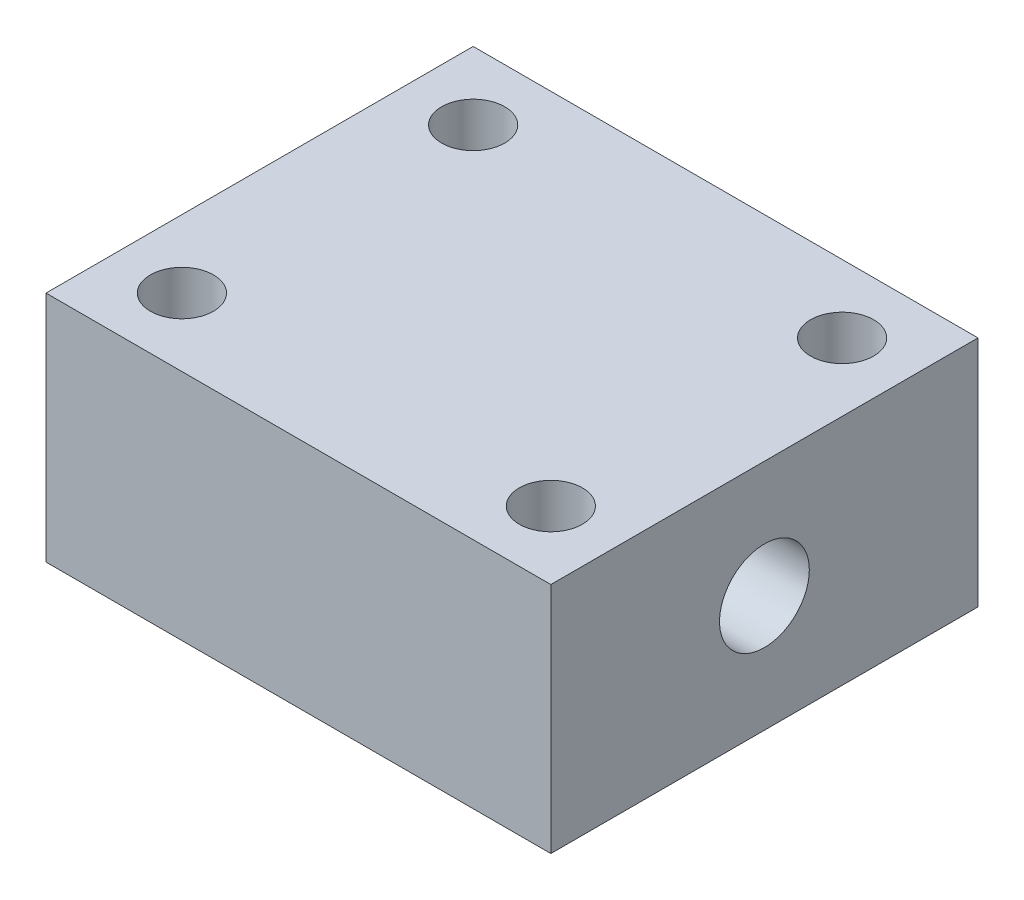
ISO-10303-21;
HEADER;
FILE_DESCRIPTION(('STEP AP214'),'2;1');
FILE_NAME('part.step','',(''),(''),'','','');
FILE_SCHEMA(('AUTOMOTIVE_DESIGN { 1 0 10303 214 1 1 1 1 }'));
ENDSEC;
DATA;
#1=APPLICATION_CONTEXT('core data for automotive mechanical design processes');
#2=APPLICATION_PROTOCOL_DEFINITION('international standard','automotive_design',2000,#1);
#3=PRODUCT_CONTEXT('',#1,'mechanical');
#4=PRODUCT('Part','Part','',(#3));
#5=PRODUCT_RELATED_PRODUCT_CATEGORY('part','',(#4));
#6=PRODUCT_DEFINITION_FORMATION('','',#4);
#7=PRODUCT_DEFINITION_CONTEXT('part definition',#1,'design');
#8=PRODUCT_DEFINITION('design','',#6,#7);
#9=PRODUCT_DEFINITION_SHAPE('','',#8);
#10=(LENGTH_UNIT() NAMED_UNIT(*) SI_UNIT(.MILLI.,.METRE.));
#11=(NAMED_UNIT(*) PLANE_ANGLE_UNIT() SI_UNIT($,.RADIAN.));
#12=(NAMED_UNIT(*) SI_UNIT($,.STERADIAN.) SOLID_ANGLE_UNIT());
#13=UNCERTAINTY_MEASURE_WITH_UNIT(LENGTH_MEASURE(1.E-05),#10,'distance_accuracy_value','');
#14=(GEOMETRIC_REPRESENTATION_CONTEXT(3) GLOBAL_UNCERTAINTY_ASSIGNED_CONTEXT((#13)) GLOBAL_UNIT_ASSIGNED_CONTEXT((#10,
#11,#12)) REPRESENTATION_CONTEXT('',''));
#15=CARTESIAN_POINT('',(0.,0.,0.));
#16=DIRECTION('',(0.,0.,1.));
#17=DIRECTION('',(1.,0.,0.));
#18=AXIS2_PLACEMENT_3D('',#15,#16,#17);
#19=CARTESIAN_POINT('',(41.275,19.05,34.925));
#20=DIRECTION('',(-1.,0.,0.));
#21=DIRECTION('',(0.,0.,1.));
#22=AXIS2_PLACEMENT_3D('',#19,#20,#21);
#23=PLANE('',#22);
#24=CARTESIAN_POINT('',(41.275,0.,0.));
#25=DIRECTION('',(1.,0.,0.));
#26=DIRECTION('',(0.,0.,-1.));
#27=AXIS2_PLACEMENT_3D('',#24,#25,#26);
#28=CIRCLE('',#27,7.3421875);
#29=CARTESIAN_POINT('',(41.275,0.,-7.3421875));
#30=VERTEX_POINT('',#29);
#31=EDGE_CURVE('E266',#30,#30,#28,.T.);
#32=ORIENTED_EDGE('',*,*,#31,.F.);
#33=EDGE_LOOP('',(#32));
#34=FACE_BOUND('',#33,.T.);
#35=DIRECTION('',(0.,0.,-1.));
#36=VECTOR('',#35,1.);
#37=CARTESIAN_POINT('',(41.275,-19.05,34.925));
#38=LINE('',#37,#36);
#39=CARTESIAN_POINT('',(41.275,-19.05,34.925));
#40=VERTEX_POINT('',#39);
#41=CARTESIAN_POINT('',(41.275,-19.05,-34.925));
#42=VERTEX_POINT('',#41);
#43=EDGE_CURVE('E197',#40,#42,#38,.T.);
#44=ORIENTED_EDGE('',*,*,#43,.T.);
#45=DIRECTION('',(0.,-1.,0.));
#46=VECTOR('',#45,1.);
#47=CARTESIAN_POINT('',(41.275,19.05,-34.925));
#48=LINE('',#47,#46);
#49=CARTESIAN_POINT('',(41.275,19.05,-34.925));
#50=VERTEX_POINT('',#49);
#51=EDGE_CURVE('E238',#50,#42,#48,.T.);
#52=ORIENTED_EDGE('',*,*,#51,.F.);
#53=DIRECTION('',(0.,0.,-1.));
#54=VECTOR('',#53,1.);
#55=CARTESIAN_POINT('',(41.275,19.05,34.925));
#56=LINE('',#55,#54);
#57=CARTESIAN_POINT('',(41.275,19.05,34.925));
#58=VERTEX_POINT('',#57);
#59=EDGE_CURVE('E201',#58,#50,#56,.T.);
#60=ORIENTED_EDGE('',*,*,#59,.F.);
#61=DIRECTION('',(0.,-1.,0.));
#62=VECTOR('',#61,1.);
#63=CARTESIAN_POINT('',(41.275,19.05,34.925));
#64=LINE('',#63,#62);
#65=EDGE_CURVE('E215',#58,#40,#64,.T.);
#66=ORIENTED_EDGE('',*,*,#65,.T.);
#67=EDGE_LOOP('',(#44,#52,#60,#66));
#68=FACE_BOUND('',#67,.T.);
#69=ADVANCED_FACE('F45',(#34,#68),#23,.F.);
#70=CARTESIAN_POINT('',(-41.275,19.05,-34.925));
#71=DIRECTION('',(0.,0.,1.));
#72=DIRECTION('',(1.,0.,0.));
#73=AXIS2_PLACEMENT_3D('',#70,#71,#72);
#74=PLANE('',#73);
#75=DIRECTION('',(-1.,0.,0.));
#76=VECTOR('',#75,1.);
#77=CARTESIAN_POINT('',(-41.275,-19.05,-34.925));
#78=LINE('',#77,#76);
#79=CARTESIAN_POINT('',(-41.275,-19.05,-34.925));
#80=VERTEX_POINT('',#79);
#81=EDGE_CURVE('E219',#42,#80,#78,.T.);
#82=ORIENTED_EDGE('',*,*,#81,.T.);
#83=DIRECTION('',(0.,-1.,0.));
#84=VECTOR('',#83,1.);
#85=CARTESIAN_POINT('',(-41.275,19.05,-34.925));
#86=LINE('',#85,#84);
#87=CARTESIAN_POINT('',(-41.275,19.05,-34.925));
#88=VERTEX_POINT('',#87);
#89=EDGE_CURVE('E234',#88,#80,#86,.T.);
#90=ORIENTED_EDGE('',*,*,#89,.F.);
#91=DIRECTION('',(-1.,0.,0.));
#92=VECTOR('',#91,1.);
#93=CARTESIAN_POINT('',(-41.275,19.05,-34.925));
#94=LINE('',#93,#92);
#95=EDGE_CURVE('E205',#50,#88,#94,.T.);
#96=ORIENTED_EDGE('',*,*,#95,.F.);
#97=ORIENTED_EDGE('',*,*,#51,.T.);
#98=EDGE_LOOP('',(#82,#90,#96,#97));
#99=FACE_BOUND('',#98,.T.);
#100=ADVANCED_FACE('F275',(#99),#74,.F.);
#101=CARTESIAN_POINT('',(-41.275,19.05,34.925));
#102=DIRECTION('',(1.,0.,0.));
#103=DIRECTION('',(0.,0.,-1.));
#104=AXIS2_PLACEMENT_3D('',#101,#102,#103);
#105=PLANE('',#104);
#106=DIRECTION('',(0.,0.,1.));
#107=VECTOR('',#106,1.);
#108=CARTESIAN_POINT('',(-41.275,-19.05,34.925));
#109=LINE('',#108,#107);
#110=CARTESIAN_POINT('',(-41.275,-19.05,34.925));
#111=VERTEX_POINT('',#110);
#112=EDGE_CURVE('E222',#80,#111,#109,.T.);
#113=ORIENTED_EDGE('',*,*,#112,.T.);
#114=DIRECTION('',(0.,-1.,0.));
#115=VECTOR('',#114,1.);
#116=CARTESIAN_POINT('',(-41.275,19.05,34.925));
#117=LINE('',#116,#115);
#118=CARTESIAN_POINT('',(-41.275,19.05,34.925));
#119=VERTEX_POINT('',#118);
#120=EDGE_CURVE('E230',#119,#111,#117,.T.);
#121=ORIENTED_EDGE('',*,*,#120,.F.);
#122=DIRECTION('',(0.,0.,1.));
#123=VECTOR('',#122,1.);
#124=CARTESIAN_POINT('',(-41.275,19.05,34.925));
#125=LINE('',#124,#123);
#126=EDGE_CURVE('E209',#88,#119,#125,.T.);
#127=ORIENTED_EDGE('',*,*,#126,.F.);
#128=ORIENTED_EDGE('',*,*,#89,.T.);
#129=EDGE_LOOP('',(#113,#121,#127,#128));
#130=FACE_BOUND('',#129,.T.);
#131=ADVANCED_FACE('F294',(#130),#105,.F.);
#132=CARTESIAN_POINT('',(-41.275,19.05,34.925));
#133=DIRECTION('',(0.,0.,-1.));
#134=DIRECTION('',(-1.,0.,0.));
#135=AXIS2_PLACEMENT_3D('',#132,#133,#134);
#136=PLANE('',#135);
#137=DIRECTION('',(1.,0.,0.));
#138=VECTOR('',#137,1.);
#139=CARTESIAN_POINT('',(-41.275,-19.05,34.925));
#140=LINE('',#139,#138);
#141=EDGE_CURVE('E206',#111,#40,#140,.T.);
#142=ORIENTED_EDGE('',*,*,#141,.T.);
#143=ORIENTED_EDGE('',*,*,#65,.F.);
#144=DIRECTION('',(1.,0.,0.));
#145=VECTOR('',#144,1.);
#146=CARTESIAN_POINT('',(-41.275,19.05,34.925));
#147=LINE('',#146,#145);
#148=EDGE_CURVE('E212',#119,#58,#147,.T.);
#149=ORIENTED_EDGE('',*,*,#148,.F.);
#150=ORIENTED_EDGE('',*,*,#120,.T.);
#151=EDGE_LOOP('',(#142,#143,#149,#150));
#152=FACE_BOUND('',#151,.T.);
#153=ADVANCED_FACE('F292',(#152),#136,.F.);
#154=CARTESIAN_POINT('',(0.,19.05,0.));
#155=DIRECTION('',(0.,-1.,0.));
#156=DIRECTION('',(0.,0.,-1.));
#157=AXIS2_PLACEMENT_3D('',#154,#155,#156);
#158=PLANE('',#157);
#159=CARTESIAN_POINT('',(30.1625,19.05,23.8125));
#160=DIRECTION('',(0.,1.,0.));
#161=DIRECTION('',(0.,0.,1.));
#162=AXIS2_PLACEMENT_3D('',#159,#160,#161);
#163=CIRCLE('',#162,5.159375);
#164=CARTESIAN_POINT('',(30.1625,19.05,28.971875));
#165=VERTEX_POINT('',#164);
#166=EDGE_CURVE('E182',#165,#165,#163,.T.);
#167=ORIENTED_EDGE('',*,*,#166,.F.);
#168=EDGE_LOOP('',(#167));
#169=FACE_BOUND('',#168,.T.);
#170=CARTESIAN_POINT('',(-30.1625,19.05,-23.8125));
#171=DIRECTION('',(0.,1.,0.));
#172=DIRECTION('',(0.,0.,1.));
#173=AXIS2_PLACEMENT_3D('',#170,#171,#172);
#174=CIRCLE('',#173,5.159375);
#175=CARTESIAN_POINT('',(-30.1625,19.05,-18.653125));
#176=VERTEX_POINT('',#175);
#177=EDGE_CURVE('E173',#176,#176,#174,.T.);
#178=ORIENTED_EDGE('',*,*,#177,.F.);
#179=EDGE_LOOP('',(#178));
#180=FACE_BOUND('',#179,.T.);
#181=CARTESIAN_POINT('',(30.1625,19.05,-23.8125));
#182=DIRECTION('',(0.,1.,0.));
#183=DIRECTION('',(0.,0.,1.));
#184=AXIS2_PLACEMENT_3D('',#181,#182,#183);
#185=CIRCLE('',#184,5.159375);
#186=CARTESIAN_POINT('',(30.1625,19.05,-18.653125));
#187=VERTEX_POINT('',#186);
#188=EDGE_CURVE('E163',#187,#187,#185,.T.);
#189=ORIENTED_EDGE('',*,*,#188,.F.);
#190=EDGE_LOOP('',(#189));
#191=FACE_BOUND('',#190,.T.);
#192=CARTESIAN_POINT('',(-30.1625,19.05,23.8125));
#193=DIRECTION('',(0.,1.,0.));
#194=DIRECTION('',(0.,0.,1.));
#195=AXIS2_PLACEMENT_3D('',#192,#193,#194);
#196=CIRCLE('',#195,5.159375);
#197=CARTESIAN_POINT('',(-30.1625,19.05,28.971875));
#198=VERTEX_POINT('',#197);
#199=EDGE_CURVE('E193',#198,#198,#196,.T.);
#200=ORIENTED_EDGE('',*,*,#199,.F.);
#201=EDGE_LOOP('',(#200));
#202=FACE_BOUND('',#201,.T.);
#203=ORIENTED_EDGE('',*,*,#59,.T.);
#204=ORIENTED_EDGE('',*,*,#95,.T.);
#205=ORIENTED_EDGE('',*,*,#126,.T.);
#206=ORIENTED_EDGE('',*,*,#148,.T.);
#207=EDGE_LOOP('',(#203,#204,#205,#206));
#208=FACE_BOUND('',#207,.T.);
#209=ADVANCED_FACE('F288',(#169,#180,#191,#202,#208),#158,.F.);
#210=CARTESIAN_POINT('',(0.,-19.05,0.));
#211=DIRECTION('',(0.,-1.,0.));
#212=DIRECTION('',(0.,0.,-1.));
#213=AXIS2_PLACEMENT_3D('',#210,#211,#212);
#214=PLANE('',#213);
#215=CARTESIAN_POINT('',(-17.4625,-19.05,0.));
#216=DIRECTION('',(0.,1.,0.));
#217=DIRECTION('',(0.,0.,1.));
#218=AXIS2_PLACEMENT_3D('',#215,#216,#217);
#219=CIRCLE('',#218,12.7254);
#220=CARTESIAN_POINT('',(-17.4625,-19.05,12.7254));
#221=VERTEX_POINT('',#220);
#222=EDGE_CURVE('E155',#221,#221,#219,.T.);
#223=ORIENTED_EDGE('',*,*,#222,.T.);
#224=EDGE_LOOP('',(#223));
#225=FACE_BOUND('',#224,.T.);
#226=CARTESIAN_POINT('',(17.4625,-19.05,0.));
#227=DIRECTION('',(0.,1.,0.));
#228=DIRECTION('',(0.,0.,1.));
#229=AXIS2_PLACEMENT_3D('',#226,#227,#228);
#230=CIRCLE('',#229,12.7254);
#231=CARTESIAN_POINT('',(17.4625,-19.05,12.7254));
#232=VERTEX_POINT('',#231);
#233=EDGE_CURVE('E149',#232,#232,#230,.T.);
#234=ORIENTED_EDGE('',*,*,#233,.T.);
#235=EDGE_LOOP('',(#234));
#236=FACE_BOUND('',#235,.T.);
#237=CARTESIAN_POINT('',(30.1625,-19.05,23.8125));
#238=DIRECTION('',(0.,1.,0.));
#239=DIRECTION('',(0.,0.,1.));
#240=AXIS2_PLACEMENT_3D('',#237,#238,#239);
#241=CIRCLE('',#240,5.159375);
#242=CARTESIAN_POINT('',(30.1625,-19.05,28.971875));
#243=VERTEX_POINT('',#242);
#244=EDGE_CURVE('E177',#243,#243,#241,.T.);
#245=ORIENTED_EDGE('',*,*,#244,.T.);
#246=EDGE_LOOP('',(#245));
#247=FACE_BOUND('',#246,.T.);
#248=CARTESIAN_POINT('',(-30.1625,-19.05,-23.8125));
#249=DIRECTION('',(0.,1.,0.));
#250=DIRECTION('',(0.,0.,1.));
#251=AXIS2_PLACEMENT_3D('',#248,#249,#250);
#252=CIRCLE('',#251,5.159375);
#253=CARTESIAN_POINT('',(-30.1625,-19.05,-18.653125));
#254=VERTEX_POINT('',#253);
#255=EDGE_CURVE('E186',#254,#254,#252,.T.);
#256=ORIENTED_EDGE('',*,*,#255,.T.);
#257=EDGE_LOOP('',(#256));
#258=FACE_BOUND('',#257,.T.);
#259=CARTESIAN_POINT('',(30.1625,-19.05,-23.8125));
#260=DIRECTION('',(0.,1.,0.));
#261=DIRECTION('',(0.,0.,1.));
#262=AXIS2_PLACEMENT_3D('',#259,#260,#261);
#263=CIRCLE('',#262,5.159375);
#264=CARTESIAN_POINT('',(30.1625,-19.05,-18.653125));
#265=VERTEX_POINT('',#264);
#266=EDGE_CURVE('E169',#265,#265,#263,.T.);
#267=ORIENTED_EDGE('',*,*,#266,.T.);
#268=EDGE_LOOP('',(#267));
#269=FACE_BOUND('',#268,.T.);
#270=CARTESIAN_POINT('',(-30.1625,-19.05,23.8125));
#271=DIRECTION('',(0.,1.,0.));
#272=DIRECTION('',(0.,0.,1.));
#273=AXIS2_PLACEMENT_3D('',#270,#271,#272);
#274=CIRCLE('',#273,5.159375);
#275=CARTESIAN_POINT('',(-30.1625,-19.05,28.971875));
#276=VERTEX_POINT('',#275);
#277=EDGE_CURVE('E181',#276,#276,#274,.T.);
#278=ORIENTED_EDGE('',*,*,#277,.T.);
#279=EDGE_LOOP('',(#278));
#280=FACE_BOUND('',#279,.T.);
#281=ORIENTED_EDGE('',*,*,#43,.F.);
#282=ORIENTED_EDGE('',*,*,#141,.F.);
#283=ORIENTED_EDGE('',*,*,#112,.F.);
#284=ORIENTED_EDGE('',*,*,#81,.F.);
#285=EDGE_LOOP('',(#281,#282,#283,#284));
#286=FACE_BOUND('',#285,.T.);
#287=ADVANCED_FACE('F282',(#225,#236,#247,#258,#269,#280,#286),#214,.T.);
#288=CARTESIAN_POINT('',(-30.1625,19.05,23.8125));
#289=DIRECTION('',(0.,-1.,0.));
#290=DIRECTION('',(0.,0.,-1.));
#291=AXIS2_PLACEMENT_3D('',#288,#289,#290);
#292=CYLINDRICAL_SURFACE('',#291,5.159375);
#293=ORIENTED_EDGE('',*,*,#199,.T.);
#294=EDGE_LOOP('',(#293));
#295=FACE_BOUND('',#294,.T.);
#296=ORIENTED_EDGE('',*,*,#277,.F.);
#297=EDGE_LOOP('',(#296));
#298=FACE_BOUND('',#297,.T.);
#299=ADVANCED_FACE('F305',(#295,#298),#292,.F.);
#300=CARTESIAN_POINT('',(30.1625,19.05,-23.8125));
#301=DIRECTION('',(0.,-1.,0.));
#302=DIRECTION('',(0.,0.,-1.));
#303=AXIS2_PLACEMENT_3D('',#300,#301,#302);
#304=CYLINDRICAL_SURFACE('',#303,5.159375);
#305=ORIENTED_EDGE('',*,*,#188,.T.);
#306=EDGE_LOOP('',(#305));
#307=FACE_BOUND('',#306,.T.);
#308=ORIENTED_EDGE('',*,*,#266,.F.);
#309=EDGE_LOOP('',(#308));
#310=FACE_BOUND('',#309,.T.);
#311=ADVANCED_FACE('F312',(#307,#310),#304,.F.);
#312=CARTESIAN_POINT('',(-30.1625,19.05,-23.8125));
#313=DIRECTION('',(0.,-1.,0.));
#314=DIRECTION('',(0.,0.,-1.));
#315=AXIS2_PLACEMENT_3D('',#312,#313,#314);
#316=CYLINDRICAL_SURFACE('',#315,5.159375);
#317=ORIENTED_EDGE('',*,*,#177,.T.);
#318=EDGE_LOOP('',(#317));
#319=FACE_BOUND('',#318,.T.);
#320=ORIENTED_EDGE('',*,*,#255,.F.);
#321=EDGE_LOOP('',(#320));
#322=FACE_BOUND('',#321,.T.);
#323=ADVANCED_FACE('F314',(#319,#322),#316,.F.);
#324=CARTESIAN_POINT('',(30.1625,19.05,23.8125));
#325=DIRECTION('',(0.,-1.,0.));
#326=DIRECTION('',(0.,0.,-1.));
#327=AXIS2_PLACEMENT_3D('',#324,#325,#326);
#328=CYLINDRICAL_SURFACE('',#327,5.159375);
#329=ORIENTED_EDGE('',*,*,#166,.T.);
#330=EDGE_LOOP('',(#329));
#331=FACE_BOUND('',#330,.T.);
#332=ORIENTED_EDGE('',*,*,#244,.F.);
#333=EDGE_LOOP('',(#332));
#334=FACE_BOUND('',#333,.T.);
#335=ADVANCED_FACE('F317',(#331,#334),#328,.F.);
#336=CARTESIAN_POINT('',(-17.4625,-16.2306,0.));
#337=DIRECTION('',(0.,-1.,0.));
#338=DIRECTION('',(0.,0.,-1.));
#339=AXIS2_PLACEMENT_3D('',#336,#337,#338);
#340=CYLINDRICAL_SURFACE('',#339,12.7254);
#341=CARTESIAN_POINT('',(-17.4625,-16.2306,0.));
#342=DIRECTION('',(0.,1.,0.));
#343=DIRECTION('',(0.,0.,1.));
#344=AXIS2_PLACEMENT_3D('',#341,#342,#343);
#345=CIRCLE('',#344,12.7254);
#346=CARTESIAN_POINT('',(-17.4625,-16.2306,12.7254));
#347=VERTEX_POINT('',#346);
#348=EDGE_CURVE('E246',#347,#347,#345,.T.);
#349=ORIENTED_EDGE('',*,*,#348,.T.);
#350=EDGE_LOOP('',(#349));
#351=FACE_BOUND('',#350,.T.);
#352=ORIENTED_EDGE('',*,*,#222,.F.);
#353=EDGE_LOOP('',(#352));
#354=FACE_BOUND('',#353,.T.);
#355=ADVANCED_FACE('F321',(#351,#354),#340,.F.);
#356=CARTESIAN_POINT('',(-17.4625,-16.2306,0.));
#357=DIRECTION('',(0.,1.,0.));
#358=DIRECTION('',(0.,0.,1.));
#359=AXIS2_PLACEMENT_3D('',#356,#357,#358);
#360=PLANE('',#359);
#361=CARTESIAN_POINT('',(-17.4625,-16.2306,0.));
#362=DIRECTION('',(0.,1.,0.));
#363=DIRECTION('',(0.,0.,1.));
#364=AXIS2_PLACEMENT_3D('',#361,#362,#363);
#365=CIRCLE('',#364,7.3421875);
#366=CARTESIAN_POINT('',(-17.4625,-16.2306,7.3421875));
#367=VERTEX_POINT('',#366);
#368=EDGE_CURVE('E242',#367,#367,#365,.T.);
#369=ORIENTED_EDGE('',*,*,#368,.T.);
#370=EDGE_LOOP('',(#369));
#371=FACE_BOUND('',#370,.T.);
#372=ORIENTED_EDGE('',*,*,#348,.F.);
#373=EDGE_LOOP('',(#372));
#374=FACE_BOUND('',#373,.T.);
#375=ADVANCED_FACE('F349',(#371,#374),#360,.F.);
#376=CARTESIAN_POINT('',(17.4625,-16.2306,0.));
#377=DIRECTION('',(0.,-1.,0.));
#378=DIRECTION('',(0.,0.,-1.));
#379=AXIS2_PLACEMENT_3D('',#376,#377,#378);
#380=CYLINDRICAL_SURFACE('',#379,12.7254);
#381=CARTESIAN_POINT('',(17.4625,-16.2306,0.));
#382=DIRECTION('',(0.,1.,0.));
#383=DIRECTION('',(0.,0.,1.));
#384=AXIS2_PLACEMENT_3D('',#381,#382,#383);
#385=CIRCLE('',#384,12.7254);
#386=CARTESIAN_POINT('',(17.4625,-16.2306,12.7254));
#387=VERTEX_POINT('',#386);
#388=EDGE_CURVE('E146',#387,#387,#385,.T.);
#389=ORIENTED_EDGE('',*,*,#388,.T.);
#390=EDGE_LOOP('',(#389));
#391=FACE_BOUND('',#390,.T.);
#392=ORIENTED_EDGE('',*,*,#233,.F.);
#393=EDGE_LOOP('',(#392));
#394=FACE_BOUND('',#393,.T.);
#395=ADVANCED_FACE('F345',(#391,#394),#380,.F.);
#396=CARTESIAN_POINT('',(17.4625,-16.2306,0.));
#397=DIRECTION('',(0.,1.,0.));
#398=DIRECTION('',(0.,0.,1.));
#399=AXIS2_PLACEMENT_3D('',#396,#397,#398);
#400=PLANE('',#399);
#401=CARTESIAN_POINT('',(17.4625,-16.2306,0.));
#402=DIRECTION('',(0.,1.,0.));
#403=DIRECTION('',(0.,0.,1.));
#404=AXIS2_PLACEMENT_3D('',#401,#402,#403);
#405=CIRCLE('',#404,7.3421875);
#406=CARTESIAN_POINT('',(17.4625,-16.2306,7.3421875));
#407=VERTEX_POINT('',#406);
#408=EDGE_CURVE('E168',#407,#407,#405,.T.);
#409=ORIENTED_EDGE('',*,*,#408,.T.);
#410=EDGE_LOOP('',(#409));
#411=FACE_BOUND('',#410,.T.);
#412=ORIENTED_EDGE('',*,*,#388,.F.);
#413=EDGE_LOOP('',(#412));
#414=FACE_BOUND('',#413,.T.);
#415=ADVANCED_FACE('F341',(#411,#414),#400,.F.);
#416=CARTESIAN_POINT('',(-17.4625,9.525,0.));
#417=DIRECTION('',(0.,1.,0.));
#418=DIRECTION('',(0.,0.,1.));
#419=AXIS2_PLACEMENT_3D('',#416,#417,#418);
#420=PLANE('',#419);
#421=CARTESIAN_POINT('',(-17.4625,9.525,0.));
#422=DIRECTION('',(0.,1.,0.));
#423=DIRECTION('',(0.,0.,1.));
#424=AXIS2_PLACEMENT_3D('',#421,#422,#423);
#425=CIRCLE('',#424,7.3421875);
#426=CARTESIAN_POINT('',(-17.4625,9.525,7.3421875));
#427=VERTEX_POINT('',#426);
#428=EDGE_CURVE('E159',#427,#427,#425,.T.);
#429=ORIENTED_EDGE('',*,*,#428,.F.);
#430=EDGE_LOOP('',(#429));
#431=FACE_BOUND('',#430,.T.);
#432=ADVANCED_FACE('F338',(#431),#420,.F.);
#433=CARTESIAN_POINT('',(-17.4625,9.525,0.));
#434=DIRECTION('',(0.,-1.,0.));
#435=DIRECTION('',(0.,0.,-1.));
#436=AXIS2_PLACEMENT_3D('',#433,#434,#435);
#437=CYLINDRICAL_SURFACE('',#436,7.3421875);
#438=CARTESIAN_POINT('',(-17.4625,0.,0.));
#439=DIRECTION('',(-0.707106781186547,-0.707106781186548,0.));
#440=DIRECTION('',(0.707106781186547,-0.707106781186548,0.));
#441=AXIS2_PLACEMENT_3D('',#438,#439,#440);
#442=ELLIPSE('',#441,10.3834211399862,7.3421875);
#443=CARTESIAN_POINT('',(-19.05,1.5875,7.16851177268729));
#444=VERTEX_POINT('',#443);
#445=CARTESIAN_POINT('',(-17.4625,0.,7.3421875));
#446=VERTEX_POINT('',#445);
#447=EDGE_CURVE('E60',#444,#446,#442,.F.);
#448=ORIENTED_EDGE('',*,*,#447,.F.);
#449=DIRECTION('',(0.,-1.,0.));
#450=VECTOR('',#449,1.);
#451=CARTESIAN_POINT('',(-19.05,9.525,7.16851177268729));
#452=LINE('',#451,#450);
#453=CARTESIAN_POINT('',(-19.05,-1.5875,7.16851177268729));
#454=VERTEX_POINT('',#453);
#455=EDGE_CURVE('E11',#444,#454,#452,.T.);
#456=ORIENTED_EDGE('',*,*,#455,.T.);
#457=CARTESIAN_POINT('',(-17.4625,0.,0.));
#458=DIRECTION('',(0.707106781186547,-0.707106781186548,0.));
#459=DIRECTION('',(-0.707106781186547,-0.707106781186548,0.));
#460=AXIS2_PLACEMENT_3D('',#457,#458,#459);
#461=ELLIPSE('',#460,10.3834211399862,7.3421875);
#462=EDGE_CURVE('E116',#446,#454,#461,.T.);
#463=ORIENTED_EDGE('',*,*,#462,.F.);
#464=CARTESIAN_POINT('',(-17.4625,0.,0.));
#465=DIRECTION('',(-0.707106781186547,-0.707106781186548,0.));
#466=DIRECTION('',(0.707106781186547,-0.707106781186548,0.));
#467=AXIS2_PLACEMENT_3D('',#464,#465,#466);
#468=ELLIPSE('',#467,10.3834211399862,7.3421875);
#469=CARTESIAN_POINT('',(-17.4625,0.,-7.3421875));
#470=VERTEX_POINT('',#469);
#471=EDGE_CURVE('E126',#470,#446,#468,.T.);
#472=ORIENTED_EDGE('',*,*,#471,.F.);
#473=CARTESIAN_POINT('',(-19.05,-1.5875,-7.16851177268729));
#474=VERTEX_POINT('',#473);
#475=EDGE_CURVE('E130',#474,#470,#461,.T.);
#476=ORIENTED_EDGE('',*,*,#475,.F.);
#477=DIRECTION('',(0.,-1.,0.));
#478=VECTOR('',#477,1.);
#479=CARTESIAN_POINT('',(-19.05,9.525,-7.16851177268729));
#480=LINE('',#479,#478);
#481=CARTESIAN_POINT('',(-19.05,1.5875,-7.16851177268729));
#482=VERTEX_POINT('',#481);
#483=EDGE_CURVE('E53',#474,#482,#480,.F.);
#484=ORIENTED_EDGE('',*,*,#483,.T.);
#485=EDGE_CURVE('E128',#470,#482,#442,.F.);
#486=ORIENTED_EDGE('',*,*,#485,.F.);
#487=CARTESIAN_POINT('',(-17.4625,0.,0.));
#488=DIRECTION('',(0.707106781186547,-0.707106781186548,0.));
#489=DIRECTION('',(-0.707106781186547,-0.707106781186548,0.));
#490=AXIS2_PLACEMENT_3D('',#487,#488,#489);
#491=ELLIPSE('',#490,10.3834211399862,7.3421875);
#492=EDGE_CURVE('E124',#446,#470,#491,.F.);
#493=ORIENTED_EDGE('',*,*,#492,.F.);
#494=EDGE_LOOP('',(#448,#456,#463,#472,#476,#484,#486,#493));
#495=FACE_BOUND('',#494,.T.);
#496=ORIENTED_EDGE('',*,*,#368,.F.);
#497=EDGE_LOOP('',(#496));
#498=FACE_BOUND('',#497,.T.);
#499=ORIENTED_EDGE('',*,*,#428,.T.);
#500=EDGE_LOOP('',(#499));
#501=FACE_BOUND('',#500,.T.);
#502=ADVANCED_FACE('F121',(#495,#498,#501),#437,.F.);
#503=CARTESIAN_POINT('',(17.4625,9.525,0.));
#504=DIRECTION('',(0.,-1.,0.));
#505=DIRECTION('',(0.,0.,-1.));
#506=AXIS2_PLACEMENT_3D('',#503,#504,#505);
#507=CYLINDRICAL_SURFACE('',#506,7.3421875);
#508=CARTESIAN_POINT('',(17.4625,0.,0.));
#509=DIRECTION('',(0.707106781186547,-0.707106781186548,0.));
#510=DIRECTION('',(-0.707106781186547,-0.707106781186548,0.));
#511=AXIS2_PLACEMENT_3D('',#508,#509,#510);
#512=ELLIPSE('',#511,10.3834211399862,7.3421875);
#513=CARTESIAN_POINT('',(17.4625,0.,7.3421875));
#514=VERTEX_POINT('',#513);
#515=CARTESIAN_POINT('',(17.4625,0.,-7.3421875));
#516=VERTEX_POINT('',#515);
#517=EDGE_CURVE('E255',#514,#516,#512,.T.);
#518=ORIENTED_EDGE('',*,*,#517,.F.);
#519=CARTESIAN_POINT('',(17.4625,0.,0.));
#520=DIRECTION('',(-0.707106781186547,-0.707106781186548,0.));
#521=DIRECTION('',(0.707106781186547,-0.707106781186548,0.));
#522=AXIS2_PLACEMENT_3D('',#519,#520,#521);
#523=ELLIPSE('',#522,10.3834211399862,7.3421875);
#524=EDGE_CURVE('E252',#516,#514,#523,.T.);
#525=ORIENTED_EDGE('',*,*,#524,.F.);
#526=EDGE_LOOP('',(#518,#525));
#527=FACE_BOUND('',#526,.T.);
#528=ORIENTED_EDGE('',*,*,#408,.F.);
#529=EDGE_LOOP('',(#528));
#530=FACE_BOUND('',#529,.T.);
#531=ADVANCED_FACE('F331',(#527,#530),#507,.F.);
#532=CARTESIAN_POINT('',(-19.05,0.,0.));
#533=DIRECTION('',(1.,0.,0.));
#534=DIRECTION('',(0.,0.,-1.));
#535=AXIS2_PLACEMENT_3D('',#532,#533,#534);
#536=CYLINDRICAL_SURFACE('',#535,7.3421875);
#537=ORIENTED_EDGE('',*,*,#492,.T.);
#538=ORIENTED_EDGE('',*,*,#471,.T.);
#539=EDGE_LOOP('',(#537,#538));
#540=FACE_BOUND('',#539,.T.);
#541=ORIENTED_EDGE('',*,*,#517,.T.);
#542=CARTESIAN_POINT('',(17.4625,0.,0.));
#543=DIRECTION('',(-0.707106781186547,-0.707106781186548,0.));
#544=DIRECTION('',(0.707106781186547,-0.707106781186548,0.));
#545=AXIS2_PLACEMENT_3D('',#542,#543,#544);
#546=ELLIPSE('',#545,10.3834211399862,7.3421875);
#547=EDGE_CURVE('E67',#516,#514,#546,.F.);
#548=ORIENTED_EDGE('',*,*,#547,.T.);
#549=EDGE_LOOP('',(#541,#548));
#550=FACE_BOUND('',#549,.T.);
#551=ADVANCED_FACE('F334',(#540,#550),#536,.F.);
#552=CARTESIAN_POINT('',(17.4625,0.,0.));
#553=DIRECTION('',(0.707106781186547,-0.707106781186548,0.));
#554=DIRECTION('',(-0.707106781186547,-0.707106781186548,0.));
#555=AXIS2_PLACEMENT_3D('',#552,#553,#554);
#556=ELLIPSE('',#555,10.3834211399862,7.3421875);
#557=EDGE_CURVE('E258',#514,#516,#556,.F.);
#558=ORIENTED_EDGE('',*,*,#557,.T.);
#559=ORIENTED_EDGE('',*,*,#524,.T.);
#560=EDGE_LOOP('',(#558,#559));
#561=FACE_BOUND('',#560,.T.);
#562=ORIENTED_EDGE('',*,*,#31,.T.);
#563=EDGE_LOOP('',(#562));
#564=FACE_BOUND('',#563,.T.);
#565=ADVANCED_FACE('F271',(#561,#564),#536,.F.);
#566=CARTESIAN_POINT('',(-19.05,0.,0.));
#567=DIRECTION('',(1.,0.,0.));
#568=DIRECTION('',(0.,0.,-1.));
#569=AXIS2_PLACEMENT_3D('',#566,#567,#568);
#570=PLANE('',#569);
#571=CARTESIAN_POINT('',(-19.05,0.,0.));
#572=DIRECTION('',(1.,0.,0.));
#573=DIRECTION('',(0.,0.,-1.));
#574=AXIS2_PLACEMENT_3D('',#571,#572,#573);
#575=CIRCLE('',#574,7.3421875);
#576=EDGE_CURVE('E118',#474,#482,#575,.T.);
#577=ORIENTED_EDGE('',*,*,#576,.T.);
#578=ORIENTED_EDGE('',*,*,#483,.F.);
#579=EDGE_LOOP('',(#577,#578));
#580=FACE_BOUND('',#579,.T.);
#581=ADVANCED_FACE('F263',(#580),#570,.T.);
#582=ORIENTED_EDGE('',*,*,#485,.T.);
#583=ORIENTED_EDGE('',*,*,#576,.F.);
#584=ORIENTED_EDGE('',*,*,#475,.T.);
#585=EDGE_LOOP('',(#582,#583,#584));
#586=FACE_BOUND('',#585,.T.);
#587=ADVANCED_FACE('F264',(#586),#536,.F.);
#588=EDGE_CURVE('E112',#444,#454,#575,.T.);
#589=ORIENTED_EDGE('',*,*,#588,.T.);
#590=ORIENTED_EDGE('',*,*,#455,.F.);
#591=EDGE_LOOP('',(#589,#590));
#592=FACE_BOUND('',#591,.T.);
#593=ADVANCED_FACE('F111',(#592),#570,.T.);
#594=ORIENTED_EDGE('',*,*,#462,.T.);
#595=ORIENTED_EDGE('',*,*,#588,.F.);
#596=ORIENTED_EDGE('',*,*,#447,.T.);
#597=EDGE_LOOP('',(#594,#595,#596));
#598=FACE_BOUND('',#597,.T.);
#599=ADVANCED_FACE('F115',(#598),#536,.F.);
#600=CARTESIAN_POINT('',(17.4625,9.525,0.));
#601=DIRECTION('',(0.,1.,0.));
#602=DIRECTION('',(0.,0.,1.));
#603=AXIS2_PLACEMENT_3D('',#600,#601,#602);
#604=PLANE('',#603);
#605=CARTESIAN_POINT('',(17.4625,9.525,0.));
#606=DIRECTION('',(0.,1.,0.));
#607=DIRECTION('',(0.,0.,1.));
#608=AXIS2_PLACEMENT_3D('',#605,#606,#607);
#609=CIRCLE('',#608,7.3421875);
#610=CARTESIAN_POINT('',(17.4625,9.525,7.3421875));
#611=VERTEX_POINT('',#610);
#612=EDGE_CURVE('E164',#611,#611,#609,.T.);
#613=ORIENTED_EDGE('',*,*,#612,.F.);
#614=EDGE_LOOP('',(#613));
#615=FACE_BOUND('',#614,.T.);
#616=ADVANCED_FACE('F326',(#615),#604,.F.);
#617=ORIENTED_EDGE('',*,*,#557,.F.);
#618=ORIENTED_EDGE('',*,*,#547,.F.);
#619=EDGE_LOOP('',(#617,#618));
#620=FACE_BOUND('',#619,.T.);
#621=ORIENTED_EDGE('',*,*,#612,.T.);
#622=EDGE_LOOP('',(#621));
#623=FACE_BOUND('',#622,.T.);
#624=ADVANCED_FACE('F329',(#620,#623),#507,.F.);
#625=CLOSED_SHELL('',(#69,#100,#131,#153,#209,#287,#299,#311,#323,#335,#355,#375,#395,#415,#432,
#502,#531,#551,#565,#581,#587,#593,#599,#616,#624));
#626=MANIFOLD_SOLID_BREP('B2',#625);
#627=ADVANCED_BREP_SHAPE_REPRESENTATION('',(#18,#626),#14);
#628=SHAPE_DEFINITION_REPRESENTATION(#9,#627);
ENDSEC;
END-ISO-10303-21;
